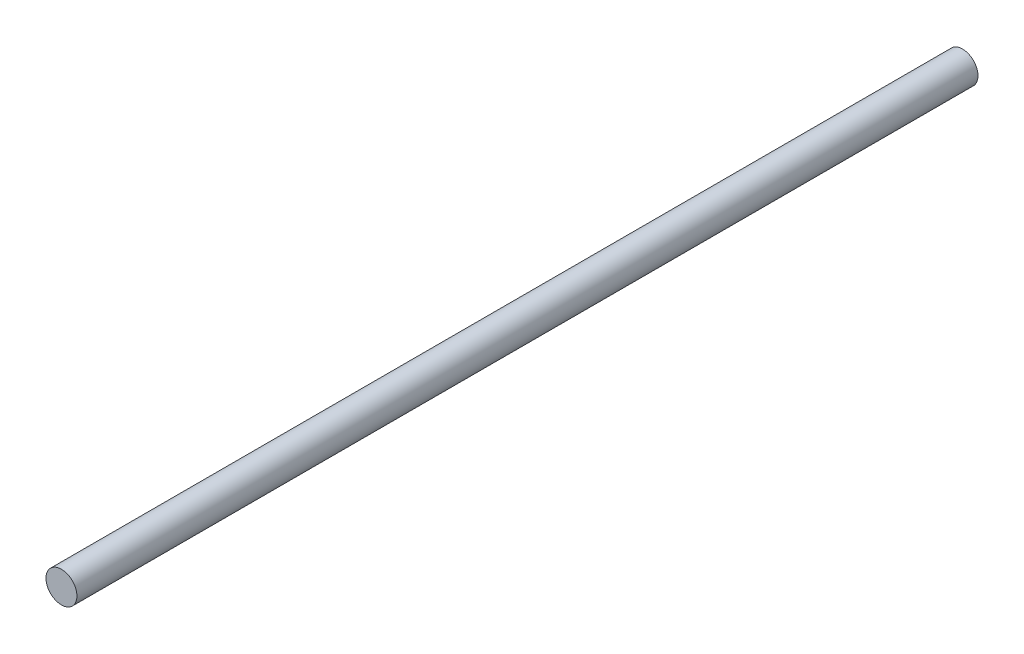
ISO-10303-21;
HEADER;
FILE_DESCRIPTION(('STEP AP214'),'2;1');
FILE_NAME('part.step','',(''),(''),'','','');
FILE_SCHEMA(('AUTOMOTIVE_DESIGN { 1 0 10303 214 1 1 1 1 }'));
ENDSEC;
DATA;
#1=APPLICATION_CONTEXT('core data for automotive mechanical design processes');
#2=APPLICATION_PROTOCOL_DEFINITION('international standard','automotive_design',2000,#1);
#3=PRODUCT_CONTEXT('',#1,'mechanical');
#4=PRODUCT('Part','Part','',(#3));
#5=PRODUCT_RELATED_PRODUCT_CATEGORY('part','',(#4));
#6=PRODUCT_DEFINITION_FORMATION('','',#4);
#7=PRODUCT_DEFINITION_CONTEXT('part definition',#1,'design');
#8=PRODUCT_DEFINITION('design','',#6,#7);
#9=PRODUCT_DEFINITION_SHAPE('','',#8);
#10=(LENGTH_UNIT() NAMED_UNIT(*) SI_UNIT(.MILLI.,.METRE.));
#11=(NAMED_UNIT(*) PLANE_ANGLE_UNIT() SI_UNIT($,.RADIAN.));
#12=(NAMED_UNIT(*) SI_UNIT($,.STERADIAN.) SOLID_ANGLE_UNIT());
#13=UNCERTAINTY_MEASURE_WITH_UNIT(LENGTH_MEASURE(1.E-05),#10,'distance_accuracy_value','');
#14=(GEOMETRIC_REPRESENTATION_CONTEXT(3) GLOBAL_UNCERTAINTY_ASSIGNED_CONTEXT((#13)) GLOBAL_UNIT_ASSIGNED_CONTEXT((#10,
#11,#12)) REPRESENTATION_CONTEXT('',''));
#15=CARTESIAN_POINT('',(0.,0.,0.));
#16=DIRECTION('',(0.,0.,1.));
#17=DIRECTION('',(1.,0.,0.));
#18=AXIS2_PLACEMENT_3D('',#15,#16,#17);
#19=CARTESIAN_POINT('',(0.,0.,184.912));
#20=DIRECTION('',(0.,0.,-1.));
#21=DIRECTION('',(-1.,0.,0.));
#22=AXIS2_PLACEMENT_3D('',#19,#20,#21);
#23=CYLINDRICAL_SURFACE('',#22,3.175);
#24=CARTESIAN_POINT('',(0.,0.,184.912));
#25=DIRECTION('',(0.,0.,1.));
#26=DIRECTION('',(1.,0.,0.));
#27=AXIS2_PLACEMENT_3D('',#24,#25,#26);
#28=CIRCLE('',#27,3.175);
#29=CARTESIAN_POINT('',(3.175,0.,184.912));
#30=VERTEX_POINT('',#29);
#31=EDGE_CURVE('E10',#30,#30,#28,.T.);
#32=ORIENTED_EDGE('',*,*,#31,.F.);
#33=EDGE_LOOP('',(#32));
#34=FACE_BOUND('',#33,.T.);
#35=CARTESIAN_POINT('',(0.,0.,0.));
#36=DIRECTION('',(0.,0.,1.));
#37=DIRECTION('',(1.,0.,0.));
#38=AXIS2_PLACEMENT_3D('',#35,#36,#37);
#39=CIRCLE('',#38,3.175);
#40=CARTESIAN_POINT('',(3.175,0.,0.));
#41=VERTEX_POINT('',#40);
#42=EDGE_CURVE('E36',#41,#41,#39,.T.);
#43=ORIENTED_EDGE('',*,*,#42,.T.);
#44=EDGE_LOOP('',(#43));
#45=FACE_BOUND('',#44,.T.);
#46=ADVANCED_FACE('F33',(#34,#45),#23,.T.);
#47=CARTESIAN_POINT('',(0.,0.,184.912));
#48=DIRECTION('',(0.,0.,1.));
#49=DIRECTION('',(1.,0.,0.));
#50=AXIS2_PLACEMENT_3D('',#47,#48,#49);
#51=PLANE('',#50);
#52=ORIENTED_EDGE('',*,*,#31,.T.);
#53=EDGE_LOOP('',(#52));
#54=FACE_BOUND('',#53,.T.);
#55=ADVANCED_FACE('F48',(#54),#51,.T.);
#56=CARTESIAN_POINT('',(0.,0.,0.));
#57=DIRECTION('',(0.,0.,1.));
#58=DIRECTION('',(1.,0.,0.));
#59=AXIS2_PLACEMENT_3D('',#56,#57,#58);
#60=PLANE('',#59);
#61=ORIENTED_EDGE('',*,*,#42,.F.);
#62=EDGE_LOOP('',(#61));
#63=FACE_BOUND('',#62,.T.);
#64=ADVANCED_FACE('F46',(#63),#60,.F.);
#65=CLOSED_SHELL('',(#46,#55,#64));
#66=MANIFOLD_SOLID_BREP('B2',#65);
#67=ADVANCED_BREP_SHAPE_REPRESENTATION('',(#18,#66),#14);
#68=SHAPE_DEFINITION_REPRESENTATION(#9,#67);
ENDSEC;
END-ISO-10303-21;
